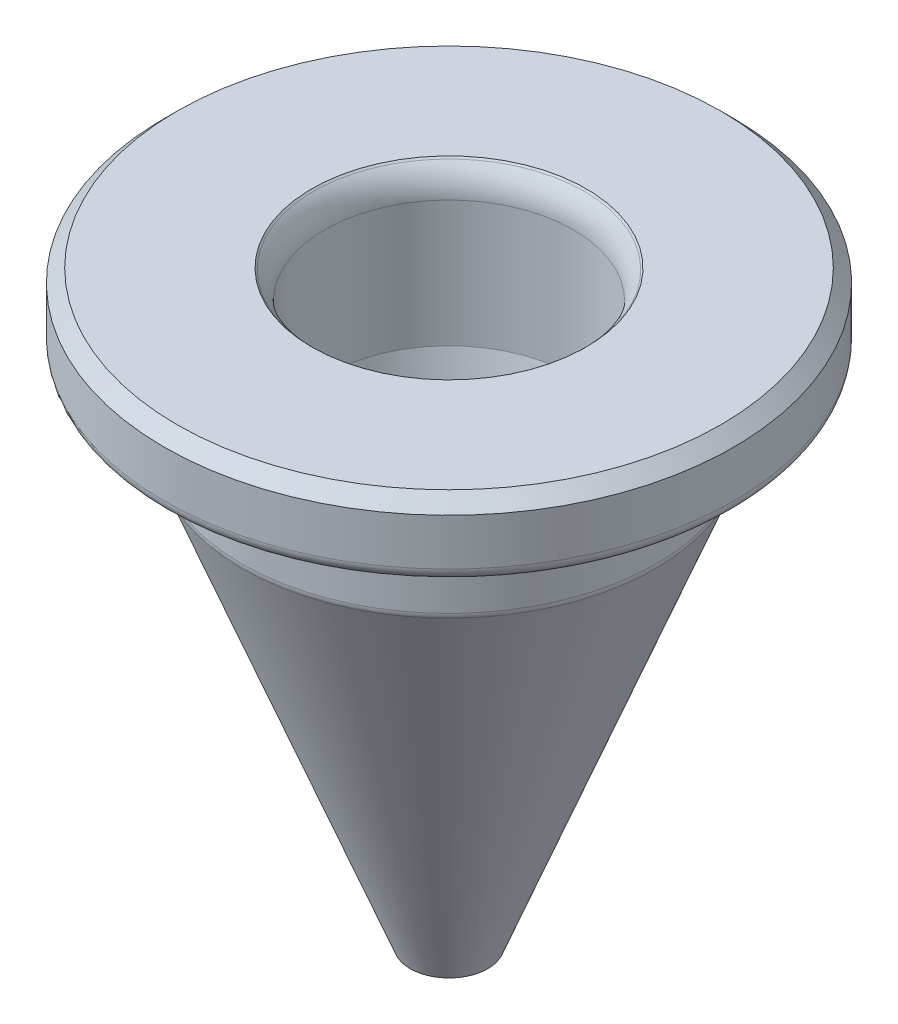
ISO-10303-21;
HEADER;
FILE_DESCRIPTION(('STEP AP214'),'2;1');
FILE_NAME('part.step','',(''),(''),'','','');
FILE_SCHEMA(('AUTOMOTIVE_DESIGN { 1 0 10303 214 1 1 1 1 }'));
ENDSEC;
DATA;
#1=APPLICATION_CONTEXT('core data for automotive mechanical design processes');
#2=APPLICATION_PROTOCOL_DEFINITION('international standard','automotive_design',2000,#1);
#3=PRODUCT_CONTEXT('',#1,'mechanical');
#4=PRODUCT('Part','Part','',(#3));
#5=PRODUCT_RELATED_PRODUCT_CATEGORY('part','',(#4));
#6=PRODUCT_DEFINITION_FORMATION('','',#4);
#7=PRODUCT_DEFINITION_CONTEXT('part definition',#1,'design');
#8=PRODUCT_DEFINITION('design','',#6,#7);
#9=PRODUCT_DEFINITION_SHAPE('','',#8);
#10=(LENGTH_UNIT() NAMED_UNIT(*) SI_UNIT(.MILLI.,.METRE.));
#11=(NAMED_UNIT(*) PLANE_ANGLE_UNIT() SI_UNIT($,.RADIAN.));
#12=(NAMED_UNIT(*) SI_UNIT($,.STERADIAN.) SOLID_ANGLE_UNIT());
#13=UNCERTAINTY_MEASURE_WITH_UNIT(LENGTH_MEASURE(1.E-05),#10,'distance_accuracy_value','');
#14=(GEOMETRIC_REPRESENTATION_CONTEXT(3) GLOBAL_UNCERTAINTY_ASSIGNED_CONTEXT((#13)) GLOBAL_UNIT_ASSIGNED_CONTEXT((#10,
#11,#12)) REPRESENTATION_CONTEXT('',''));
#15=CARTESIAN_POINT('',(0.,0.,0.));
#16=DIRECTION('',(0.,0.,1.));
#17=DIRECTION('',(1.,0.,0.));
#18=AXIS2_PLACEMENT_3D('',#15,#16,#17);
#19=CARTESIAN_POINT('',(0.,0.,0.));
#20=DIRECTION('',(0.,-1.,0.));
#21=DIRECTION('',(0.,0.,-1.));
#22=AXIS2_PLACEMENT_3D('',#19,#20,#21);
#23=CYLINDRICAL_SURFACE('',#22,8.);
#24=CARTESIAN_POINT('',(0.,19.7,0.));
#25=DIRECTION('',(0.,1.,0.));
#26=DIRECTION('',(0.,0.,1.));
#27=AXIS2_PLACEMENT_3D('',#24,#25,#26);
#28=CIRCLE('',#27,8.);
#29=CARTESIAN_POINT('',(0.,19.7,8.));
#30=VERTEX_POINT('',#29);
#31=EDGE_CURVE('E66',#30,#30,#28,.F.);
#32=ORIENTED_EDGE('',*,*,#31,.T.);
#33=EDGE_LOOP('',(#32));
#34=FACE_BOUND('',#33,.T.);
#35=CARTESIAN_POINT('',(0.,17.0938753430975,0.));
#36=DIRECTION('',(0.,1.,0.));
#37=DIRECTION('',(0.,0.,1.));
#38=AXIS2_PLACEMENT_3D('',#35,#36,#37);
#39=CIRCLE('',#38,8.);
#40=CARTESIAN_POINT('',(0.,17.0938753430975,8.));
#41=VERTEX_POINT('',#40);
#42=EDGE_CURVE('E69',#41,#41,#39,.T.);
#43=ORIENTED_EDGE('',*,*,#42,.T.);
#44=EDGE_LOOP('',(#43));
#45=FACE_BOUND('',#44,.T.);
#46=ADVANCED_FACE('F40',(#34,#45),#23,.T.);
#47=CARTESIAN_POINT('',(0.,0.,0.));
#48=DIRECTION('',(0.,1.,0.));
#49=DIRECTION('',(0.,0.,1.));
#50=AXIS2_PLACEMENT_3D('',#47,#48,#49);
#51=CONICAL_SURFACE('',#50,1.,1.03037682652431);
#52=CARTESIAN_POINT('',(0.,0.3,0.));
#53=DIRECTION('',(0.,-1.,0.));
#54=DIRECTION('',(0.,0.,-1.));
#55=AXIS2_PLACEMENT_3D('',#52,#53,#54);
#56=CIRCLE('',#55,1.5);
#57=CARTESIAN_POINT('',(0.,0.3,1.5));
#58=VERTEX_POINT('',#57);
#59=EDGE_CURVE('E87',#58,#58,#56,.T.);
#60=ORIENTED_EDGE('',*,*,#59,.T.);
#61=EDGE_LOOP('',(#60));
#62=FACE_BOUND('',#61,.T.);
#63=CARTESIAN_POINT('',(0.,0.,0.));
#64=DIRECTION('',(0.,-1.,0.));
#65=DIRECTION('',(0.,0.,-1.));
#66=AXIS2_PLACEMENT_3D('',#63,#64,#65);
#67=CIRCLE('',#66,1.);
#68=CARTESIAN_POINT('',(0.,0.,1.));
#69=VERTEX_POINT('',#68);
#70=EDGE_CURVE('E81',#69,#69,#67,.T.);
#71=ORIENTED_EDGE('',*,*,#70,.F.);
#72=EDGE_LOOP('',(#71));
#73=FACE_BOUND('',#72,.T.);
#74=ADVANCED_FACE('F91',(#62,#73),#51,.T.);
#75=CARTESIAN_POINT('',(0.,17.,0.));
#76=DIRECTION('',(0.,1.,0.));
#77=DIRECTION('',(0.,0.,1.));
#78=AXIS2_PLACEMENT_3D('',#75,#76,#77);
#79=CONICAL_SURFACE('',#78,4.8,0.219914275242624);
#80=CARTESIAN_POINT('',(0.,17.,0.));
#81=DIRECTION('',(0.,-1.,0.));
#82=DIRECTION('',(0.,0.,-1.));
#83=AXIS2_PLACEMENT_3D('',#80,#81,#82);
#84=CIRCLE('',#83,4.8);
#85=CARTESIAN_POINT('',(0.,17.,4.8));
#86=VERTEX_POINT('',#85);
#87=EDGE_CURVE('E84',#86,#86,#84,.T.);
#88=CARTESIAN_POINT('',(0.,0.,1.));
#89=CARTESIAN_POINT('',(0.,0.177083333333337,1.03958333333333));
#90=CARTESIAN_POINT('',(0.,0.35416666666667,1.07916666666667));
#91=CARTESIAN_POINT('',(0.,0.708333333333337,1.15833333333333));
#92=CARTESIAN_POINT('',(0.,0.885416666666671,1.19791666666667));
#93=CARTESIAN_POINT('',(0.,1.23958333333334,1.27708333333333));
#94=CARTESIAN_POINT('',(0.,1.41666666666667,1.31666666666667));
#95=CARTESIAN_POINT('',(0.,1.77083333333334,1.39583333333333));
#96=CARTESIAN_POINT('',(0.,1.94791666666667,1.43541666666667));
#97=CARTESIAN_POINT('',(0.,2.30208333333334,1.51458333333333));
#98=CARTESIAN_POINT('',(0.,2.47916666666667,1.55416666666667));
#99=CARTESIAN_POINT('',(0.,2.83333333333334,1.63333333333333));
#100=CARTESIAN_POINT('',(0.,3.01041666666667,1.67291666666667));
#101=CARTESIAN_POINT('',(0.,3.36458333333334,1.75208333333333));
#102=CARTESIAN_POINT('',(0.,3.54166666666667,1.79166666666667));
#103=CARTESIAN_POINT('',(0.,3.89583333333334,1.87083333333333));
#104=CARTESIAN_POINT('',(0.,4.07291666666667,1.91041666666667));
#105=CARTESIAN_POINT('',(0.,4.42708333333333,1.98958333333333));
#106=CARTESIAN_POINT('',(0.,4.60416666666667,2.02916666666667));
#107=CARTESIAN_POINT('',(0.,4.95833333333333,2.10833333333333));
#108=CARTESIAN_POINT('',(0.,5.13541666666667,2.14791666666667));
#109=CARTESIAN_POINT('',(0.,5.48958333333333,2.22708333333333));
#110=CARTESIAN_POINT('',(0.,5.66666666666667,2.26666666666667));
#111=CARTESIAN_POINT('',(0.,6.02083333333334,2.34583333333333));
#112=CARTESIAN_POINT('',(0.,6.19791666666667,2.38541666666667));
#113=CARTESIAN_POINT('',(0.,6.55208333333333,2.46458333333333));
#114=CARTESIAN_POINT('',(0.,6.72916666666667,2.50416666666667));
#115=CARTESIAN_POINT('',(0.,7.08333333333333,2.58333333333333));
#116=CARTESIAN_POINT('',(0.,7.26041666666667,2.62291666666667));
#117=CARTESIAN_POINT('',(0.,7.61458333333333,2.70208333333333));
#118=CARTESIAN_POINT('',(0.,7.79166666666667,2.74166666666667));
#119=CARTESIAN_POINT('',(0.,8.14583333333333,2.82083333333333));
#120=CARTESIAN_POINT('',(0.,8.32291666666667,2.86041666666667));
#121=CARTESIAN_POINT('',(0.,8.67708333333333,2.93958333333333));
#122=CARTESIAN_POINT('',(0.,8.85416666666667,2.97916666666667));
#123=CARTESIAN_POINT('',(0.,9.20833333333333,3.05833333333333));
#124=CARTESIAN_POINT('',(0.,9.38541666666667,3.09791666666667));
#125=CARTESIAN_POINT('',(0.,9.73958333333333,3.17708333333333));
#126=CARTESIAN_POINT('',(0.,9.91666666666667,3.21666666666667));
#127=CARTESIAN_POINT('',(0.,10.2708333333333,3.29583333333333));
#128=CARTESIAN_POINT('',(0.,10.4479166666667,3.33541666666667));
#129=CARTESIAN_POINT('',(0.,10.8020833333333,3.41458333333333));
#130=CARTESIAN_POINT('',(0.,10.9791666666667,3.45416666666667));
#131=CARTESIAN_POINT('',(0.,11.3333333333333,3.53333333333333));
#132=CARTESIAN_POINT('',(0.,11.5104166666667,3.57291666666667));
#133=CARTESIAN_POINT('',(0.,11.8645833333333,3.65208333333333));
#134=CARTESIAN_POINT('',(0.,12.0416666666667,3.69166666666667));
#135=CARTESIAN_POINT('',(0.,12.3958333333333,3.77083333333333));
#136=CARTESIAN_POINT('',(0.,12.5729166666667,3.81041666666667));
#137=CARTESIAN_POINT('',(0.,12.9270833333333,3.88958333333333));
#138=CARTESIAN_POINT('',(0.,13.1041666666667,3.92916666666667));
#139=CARTESIAN_POINT('',(0.,13.4583333333333,4.00833333333333));
#140=CARTESIAN_POINT('',(0.,13.6354166666667,4.04791666666667));
#141=CARTESIAN_POINT('',(0.,13.9895833333333,4.12708333333333));
#142=CARTESIAN_POINT('',(0.,14.1666666666667,4.16666666666667));
#143=CARTESIAN_POINT('',(0.,14.5208333333333,4.24583333333333));
#144=CARTESIAN_POINT('',(0.,14.6979166666667,4.28541666666667));
#145=CARTESIAN_POINT('',(0.,15.0520833333333,4.36458333333333));
#146=CARTESIAN_POINT('',(0.,15.2291666666667,4.40416666666667));
#147=CARTESIAN_POINT('',(0.,15.5833333333333,4.48333333333333));
#148=CARTESIAN_POINT('',(0.,15.7604166666667,4.52291666666667));
#149=CARTESIAN_POINT('',(0.,16.1145833333333,4.60208333333333));
#150=CARTESIAN_POINT('',(0.,16.2916666666667,4.64166666666667));
#151=CARTESIAN_POINT('',(0.,16.6458333333333,4.72083333333333));
#152=CARTESIAN_POINT('',(0.,16.8229166666667,4.76041666666667));
#153=CARTESIAN_POINT('',(0.,17.,4.8));
#154=B_SPLINE_CURVE_WITH_KNOTS('',3,(#88,#89,#90,#91,#92,#93,#94,#95,#96,#97,#98,#99,#100,#101,
#102,#103,#104,#105,#106,#107,#108,#109,#110,#111,#112,#113,#114,#115,#116,#117,#118,#119,#120,
#121,#122,#123,#124,#125,#126,#127,#128,#129,#130,#131,#132,#133,#134,#135,#136,#137,#138,#139,
#140,#141,#142,#143,#144,#145,#146,#147,#148,#149,#150,#151,#152,#153),.UNSPECIFIED.,.F.,.F.,(4,
2,2,2,2,2,2,2,2,2,2,2,2,2,2,2,2,2,2,2,2,2,2,2,2,2,2,2,2,2,2,2,4),(0.,0.544360289697917,
1.08872057939583,1.63308086909375,2.17744115879167,2.72180144848958,3.2661617381875,
3.81052202788542,4.35488231758333,4.89924260728125,5.44360289697917,5.98796318667708,
6.532323476375,7.07668376607292,7.62104405577083,8.16540434546875,8.70976463516667,
9.25412492486459,9.7984852145625,10.3428455042604,10.8872057939583,11.4315660836563,
11.9759263733542,12.5202866630521,13.06464695275,13.6090072424479,14.1533675321458,
14.6977278218438,15.2420881115417,15.7864484012396,16.3308086909375,16.8751689806354,
17.4195292703333),.UNSPECIFIED.);
#155=EDGE_CURVE('BSEAM118',#69,#86,#154,.T.);
#156=ORIENTED_EDGE('',*,*,#70,.T.);
#157=ORIENTED_EDGE('',*,*,#87,.F.);
#158=ORIENTED_EDGE('',*,*,#155,.T.);
#159=ORIENTED_EDGE('',*,*,#155,.F.);
#160=EDGE_LOOP('',(#156,#158,#157,#159));
#161=FACE_BOUND('',#160,.T.);
#162=ADVANCED_FACE('F118',(#161),#79,.F.);
#163=CARTESIAN_POINT('',(0.,0.,0.));
#164=DIRECTION('',(0.,-1.,0.));
#165=DIRECTION('',(0.,0.,-1.));
#166=AXIS2_PLACEMENT_3D('',#163,#164,#165);
#167=CYLINDRICAL_SURFACE('',#166,4.8);
#168=CARTESIAN_POINT('',(0.,21.8786796564404,0.));
#169=DIRECTION('',(0.,-1.,0.));
#170=DIRECTION('',(0.,0.,-1.));
#171=AXIS2_PLACEMENT_3D('',#168,#169,#170);
#172=CIRCLE('',#171,4.8);
#173=CARTESIAN_POINT('',(0.,21.8786796564404,-4.8));
#174=VERTEX_POINT('',#173);
#175=EDGE_CURVE('E47',#174,#174,#172,.F.);
#176=ORIENTED_EDGE('',*,*,#175,.T.);
#177=EDGE_LOOP('',(#176));
#178=FACE_BOUND('',#177,.T.);
#179=ORIENTED_EDGE('',*,*,#87,.T.);
#180=EDGE_LOOP('',(#179));
#181=FACE_BOUND('',#180,.T.);
#182=ADVANCED_FACE('F109',(#178,#181),#167,.F.);
#183=CARTESIAN_POINT('',(4.8,23.,0.));
#184=DIRECTION('',(0.,1.,0.));
#185=DIRECTION('',(0.,0.,1.));
#186=AXIS2_PLACEMENT_3D('',#183,#184,#185);
#187=PLANE('',#186);
#188=CARTESIAN_POINT('',(0.,23.,0.));
#189=DIRECTION('',(0.,1.,0.));
#190=DIRECTION('',(0.,0.,1.));
#191=AXIS2_PLACEMENT_3D('',#188,#189,#190);
#192=CIRCLE('',#191,10.5);
#193=CARTESIAN_POINT('',(0.,23.,10.5));
#194=VERTEX_POINT('',#193);
#195=EDGE_CURVE('E55',#194,#194,#192,.T.);
#196=ORIENTED_EDGE('',*,*,#195,.T.);
#197=EDGE_LOOP('',(#196));
#198=FACE_BOUND('',#197,.T.);
#199=CARTESIAN_POINT('',(0.,23.,0.));
#200=DIRECTION('',(0.,1.,0.));
#201=DIRECTION('',(0.,0.,1.));
#202=AXIS2_PLACEMENT_3D('',#199,#200,#201);
#203=CIRCLE('',#202,5.3);
#204=CARTESIAN_POINT('',(0.,23.,5.3));
#205=VERTEX_POINT('',#204);
#206=EDGE_CURVE('E60',#205,#205,#203,.F.);
#207=ORIENTED_EDGE('',*,*,#206,.T.);
#208=EDGE_LOOP('',(#207));
#209=FACE_BOUND('',#208,.T.);
#210=ADVANCED_FACE('F97',(#198,#209),#187,.T.);
#211=CARTESIAN_POINT('',(0.,0.3,0.));
#212=DIRECTION('',(0.,1.,0.));
#213=DIRECTION('',(0.,0.,1.));
#214=AXIS2_PLACEMENT_3D('',#211,#212,#213);
#215=CONICAL_SURFACE('',#214,1.5,0.371180222638774);
#216=CARTESIAN_POINT('',(0.,16.9125175762486,0.));
#217=DIRECTION('',(0.,-1.,0.));
#218=DIRECTION('',(0.,0.,-1.));
#219=AXIS2_PLACEMENT_3D('',#216,#217,#218);
#220=CIRCLE('',#219,7.9659499548273);
#221=CARTESIAN_POINT('',(0.,16.9125175762486,7.9659499548273));
#222=VERTEX_POINT('',#221);
#223=EDGE_CURVE('E63',#222,#222,#220,.T.);
#224=CARTESIAN_POINT('',(0.,16.9125175762486,7.9659499548273));
#225=CARTESIAN_POINT('',(0.,16.7394705181627,7.89859630946451));
#226=CARTESIAN_POINT('',(0.,16.5664234600767,7.83124266410173));
#227=CARTESIAN_POINT('',(0.,16.2203293439049,7.69653537337616));
#228=CARTESIAN_POINT('',(0.,16.047282285819,7.62918172801337));
#229=CARTESIAN_POINT('',(0.,15.7011881696471,7.49447443728781));
#230=CARTESIAN_POINT('',(0.,15.5281411115612,7.42712079192502));
#231=CARTESIAN_POINT('',(0.,15.1820469953894,7.29241350119945));
#232=CARTESIAN_POINT('',(0.,15.0089999373034,7.22505985583667));
#233=CARTESIAN_POINT('',(0.,14.6629058211316,7.0903525651111));
#234=CARTESIAN_POINT('',(0.,14.4898587630457,7.02299891974832));
#235=CARTESIAN_POINT('',(0.,14.1437646468738,6.88829162902275));
#236=CARTESIAN_POINT('',(0.,13.9707175887879,6.82093798365996));
#237=CARTESIAN_POINT('',(0.,13.6246234726161,6.6862306929344));
#238=CARTESIAN_POINT('',(0.,13.4515764145301,6.61887704757161));
#239=CARTESIAN_POINT('',(0.,13.1054822983583,6.48416975684604));
#240=CARTESIAN_POINT('',(0.,12.9324352402724,6.41681611148326));
#241=CARTESIAN_POINT('',(0.,12.5863411241005,6.28210882075769));
#242=CARTESIAN_POINT('',(0.,12.4132940660146,6.21475517539491));
#243=CARTESIAN_POINT('',(0.,12.0671999498428,6.08004788466934));
#244=CARTESIAN_POINT('',(0.,11.8941528917568,6.01269423930655));
#245=CARTESIAN_POINT('',(0.,11.548058775585,5.87798694858098));
#246=CARTESIAN_POINT('',(0.,11.3750117174991,5.8106333032182));
#247=CARTESIAN_POINT('',(0.,11.0289176013272,5.67592601249263));
#248=CARTESIAN_POINT('',(0.,10.8558705432413,5.60857236712985));
#249=CARTESIAN_POINT('',(0.,10.5097764270694,5.47386507640428));
#250=CARTESIAN_POINT('',(0.,10.3367293689835,5.40651143104149));
#251=CARTESIAN_POINT('',(0.,9.99063525281168,5.27180414031592));
#252=CARTESIAN_POINT('',(0.,9.81758819472575,5.20445049495314));
#253=CARTESIAN_POINT('',(0.,9.47149407855391,5.06974320422757));
#254=CARTESIAN_POINT('',(0.,9.29844702046799,5.00238955886479));
#255=CARTESIAN_POINT('',(0.,8.95235290429614,4.86768226813922));
#256=CARTESIAN_POINT('',(0.,8.77930584621022,4.80032862277643));
#257=CARTESIAN_POINT('',(0.,8.43321173003837,4.66562133205086));
#258=CARTESIAN_POINT('',(0.,8.26016467195245,4.59826768668808));
#259=CARTESIAN_POINT('',(0.,7.9140705557806,4.46356039596251));
#260=CARTESIAN_POINT('',(0.,7.74102349769468,4.39620675059973));
#261=CARTESIAN_POINT('',(0.,7.39492938152283,4.26149945987416));
#262=CARTESIAN_POINT('',(0.,7.22188232343691,4.19414581451137));
#263=CARTESIAN_POINT('',(0.,6.87578820726507,4.05943852378581));
#264=CARTESIAN_POINT('',(0.,6.70274114917914,3.99208487842302));
#265=CARTESIAN_POINT('',(0.,6.3566470330073,3.85737758769745));
#266=CARTESIAN_POINT('',(0.,6.18359997492138,3.79002394233467));
#267=CARTESIAN_POINT('',(0.,5.83750585874953,3.6553166516091));
#268=CARTESIAN_POINT('',(0.,5.66445880066361,3.58796300624632));
#269=CARTESIAN_POINT('',(0.,5.31836468449176,3.45325571552075));
#270=CARTESIAN_POINT('',(0.,5.14531762640584,3.38590207015796));
#271=CARTESIAN_POINT('',(0.,4.79922351023399,3.25119477943239));
#272=CARTESIAN_POINT('',(0.,4.62617645214807,3.18384113406961));
#273=CARTESIAN_POINT('',(0.,4.28008233597622,3.04913384334404));
#274=CARTESIAN_POINT('',(0.,4.1070352778903,2.98178019798126));
#275=CARTESIAN_POINT('',(0.,3.76094116171846,2.84707290725569));
#276=CARTESIAN_POINT('',(0.,3.58789410363253,2.7797192618929));
#277=CARTESIAN_POINT('',(0.,3.24179998746069,2.64501197116733));
#278=CARTESIAN_POINT('',(0.,3.06875292937476,2.57765832580455));
#279=CARTESIAN_POINT('',(0.,2.72265881320292,2.44295103507898));
#280=CARTESIAN_POINT('',(0.,2.549611755117,2.3755973897162));
#281=CARTESIAN_POINT('',(0.,2.20351763894515,2.24089009899063));
#282=CARTESIAN_POINT('',(0.,2.03047058085923,2.17353645362784));
#283=CARTESIAN_POINT('',(0.,1.68437646468738,2.03882916290228));
#284=CARTESIAN_POINT('',(0.,1.51132940660146,1.97147551753949));
#285=CARTESIAN_POINT('',(0.,1.16523529042961,1.83676822681392));
#286=CARTESIAN_POINT('',(0.,0.992188232343692,1.76941458145114));
#287=CARTESIAN_POINT('',(0.,0.646094116171846,1.63470729072557));
#288=CARTESIAN_POINT('',(0.,0.473047058085923,1.56735364536278));
#289=CARTESIAN_POINT('',(0.,0.3,1.5));
#290=B_SPLINE_CURVE_WITH_KNOTS('',3,(#224,#225,#226,#227,#228,#229,#230,#231,#232,#233,#234,
#235,#236,#237,#238,#239,#240,#241,#242,#243,#244,#245,#246,#247,#248,#249,#250,#251,#252,#253,
#254,#255,#256,#257,#258,#259,#260,#261,#262,#263,#264,#265,#266,#267,#268,#269,#270,#271,#272,
#273,#274,#275,#276,#277,#278,#279,#280,#281,#282,#283,#284,#285,#286,#287,#288,#289),
.UNSPECIFIED.,.F.,.F.,(4,2,2,2,2,2,2,2,2,2,2,2,2,2,2,2,2,2,2,2,2,2,2,2,2,2,2,2,2,2,2,2,4),(0.,
0.557078253661581,1.11415650732316,1.67123476098474,2.22831301464633,2.78539126830791,
3.34246952196948,3.89954777563106,4.45662602929265,5.01370428295423,5.57078253661581,
6.12786079027739,6.68493904393897,7.24201729760055,7.79909555126213,8.35617380492371,
8.91325205858529,9.47033031224687,10.0274085659084,10.58448681957,11.1415650732316,
11.6986433268932,12.2557215805548,12.8127998342163,13.3698780878779,13.9269563415395,
14.4840345952011,15.0411128488627,15.5981911025242,16.1552693561858,16.7123476098474,
17.269425863509,17.8265041171706),.UNSPECIFIED.);
#291=EDGE_CURVE('BSEAM94',#222,#58,#290,.T.);
#292=ORIENTED_EDGE('',*,*,#223,.T.);
#293=ORIENTED_EDGE('',*,*,#59,.F.);
#294=ORIENTED_EDGE('',*,*,#291,.T.);
#295=ORIENTED_EDGE('',*,*,#291,.F.);
#296=EDGE_LOOP('',(#292,#294,#293,#295));
#297=FACE_BOUND('',#296,.T.);
#298=ADVANCED_FACE('F94',(#297),#215,.T.);
#299=CARTESIAN_POINT('',(0.,20.2,0.));
#300=DIRECTION('',(0.,1.,0.));
#301=DIRECTION('',(0.,0.,1.));
#302=AXIS2_PLACEMENT_3D('',#299,#300,#301);
#303=CYLINDRICAL_SURFACE('',#302,11.);
#304=CARTESIAN_POINT('',(0.,22.5,0.));
#305=DIRECTION('',(0.,1.,0.));
#306=DIRECTION('',(0.,0.,1.));
#307=AXIS2_PLACEMENT_3D('',#304,#305,#306);
#308=CIRCLE('',#307,11.);
#309=CARTESIAN_POINT('',(0.,22.5,11.));
#310=VERTEX_POINT('',#309);
#311=EDGE_CURVE('E51',#310,#310,#308,.F.);
#312=ORIENTED_EDGE('',*,*,#311,.T.);
#313=EDGE_LOOP('',(#312));
#314=FACE_BOUND('',#313,.T.);
#315=CARTESIAN_POINT('',(0.,20.7,0.));
#316=DIRECTION('',(0.,1.,0.));
#317=DIRECTION('',(0.,0.,1.));
#318=AXIS2_PLACEMENT_3D('',#315,#316,#317);
#319=CIRCLE('',#318,11.);
#320=CARTESIAN_POINT('',(0.,20.7,11.));
#321=VERTEX_POINT('',#320);
#322=EDGE_CURVE('E78',#321,#321,#319,.T.);
#323=ORIENTED_EDGE('',*,*,#322,.T.);
#324=EDGE_LOOP('',(#323));
#325=FACE_BOUND('',#324,.T.);
#326=ADVANCED_FACE('F96',(#314,#325),#303,.T.);
#327=CARTESIAN_POINT('',(0.,20.2,0.));
#328=DIRECTION('',(0.,1.,0.));
#329=DIRECTION('',(0.,0.,1.));
#330=AXIS2_PLACEMENT_3D('',#327,#328,#329);
#331=PLANE('',#330);
#332=CARTESIAN_POINT('',(0.,20.2,0.));
#333=DIRECTION('',(0.,1.,0.));
#334=DIRECTION('',(0.,0.,1.));
#335=AXIS2_PLACEMENT_3D('',#332,#333,#334);
#336=CIRCLE('',#335,10.5);
#337=CARTESIAN_POINT('',(0.,20.2,10.5));
#338=VERTEX_POINT('',#337);
#339=EDGE_CURVE('E72',#338,#338,#336,.F.);
#340=ORIENTED_EDGE('',*,*,#339,.T.);
#341=EDGE_LOOP('',(#340));
#342=FACE_BOUND('',#341,.T.);
#343=CARTESIAN_POINT('',(0.,20.2,0.));
#344=DIRECTION('',(0.,1.,0.));
#345=DIRECTION('',(0.,0.,1.));
#346=AXIS2_PLACEMENT_3D('',#343,#344,#345);
#347=CIRCLE('',#346,8.5);
#348=CARTESIAN_POINT('',(0.,20.2,8.5));
#349=VERTEX_POINT('',#348);
#350=EDGE_CURVE('E75',#349,#349,#347,.T.);
#351=ORIENTED_EDGE('',*,*,#350,.T.);
#352=EDGE_LOOP('',(#351));
#353=FACE_BOUND('',#352,.T.);
#354=ADVANCED_FACE('F105',(#342,#353),#331,.F.);
#355=CARTESIAN_POINT('',(0.,20.7,0.));
#356=DIRECTION('',(0.,1.,0.));
#357=DIRECTION('',(0.,0.,1.));
#358=AXIS2_PLACEMENT_3D('',#355,#356,#357);
#359=TOROIDAL_SURFACE('',#358,10.5,0.5);
#360=ORIENTED_EDGE('',*,*,#339,.F.);
#361=EDGE_LOOP('',(#360));
#362=FACE_BOUND('',#361,.T.);
#363=ORIENTED_EDGE('',*,*,#322,.F.);
#364=EDGE_LOOP('',(#363));
#365=FACE_BOUND('',#364,.T.);
#366=ADVANCED_FACE('F126',(#362,#365),#359,.T.);
#367=CARTESIAN_POINT('',(0.,19.7,0.));
#368=DIRECTION('',(0.,1.,0.));
#369=DIRECTION('',(0.,0.,1.));
#370=AXIS2_PLACEMENT_3D('',#367,#368,#369);
#371=TOROIDAL_SURFACE('',#370,8.5,0.5);
#372=ORIENTED_EDGE('',*,*,#350,.F.);
#373=EDGE_LOOP('',(#372));
#374=FACE_BOUND('',#373,.T.);
#375=ORIENTED_EDGE('',*,*,#31,.F.);
#376=EDGE_LOOP('',(#375));
#377=FACE_BOUND('',#376,.T.);
#378=ADVANCED_FACE('F129',(#374,#377),#371,.F.);
#379=CARTESIAN_POINT('',(0.,17.0938753430975,0.));
#380=DIRECTION('',(0.,1.,0.));
#381=DIRECTION('',(0.,0.,1.));
#382=AXIS2_PLACEMENT_3D('',#379,#380,#381);
#383=TOROIDAL_SURFACE('',#382,7.5,0.5);
#384=ORIENTED_EDGE('',*,*,#42,.F.);
#385=EDGE_LOOP('',(#384));
#386=FACE_BOUND('',#385,.T.);
#387=ORIENTED_EDGE('',*,*,#223,.F.);
#388=EDGE_LOOP('',(#387));
#389=FACE_BOUND('',#388,.T.);
#390=ADVANCED_FACE('F133',(#386,#389),#383,.T.);
#391=CARTESIAN_POINT('',(0.,23.,0.));
#392=DIRECTION('',(0.,-1.,0.));
#393=DIRECTION('',(0.,0.,-1.));
#394=AXIS2_PLACEMENT_3D('',#391,#392,#393);
#395=CONICAL_SURFACE('',#394,10.5,0.785398163397452);
#396=ORIENTED_EDGE('',*,*,#311,.F.);
#397=EDGE_LOOP('',(#396));
#398=FACE_BOUND('',#397,.T.);
#399=ORIENTED_EDGE('',*,*,#195,.F.);
#400=EDGE_LOOP('',(#399));
#401=FACE_BOUND('',#400,.T.);
#402=ADVANCED_FACE('F137',(#398,#401),#395,.T.);
#403=CARTESIAN_POINT('',(0.,23.,0.));
#404=DIRECTION('',(0.,1.,0.));
#405=DIRECTION('',(0.,0.,1.));
#406=AXIS2_PLACEMENT_3D('',#403,#404,#405);
#407=CONICAL_SURFACE('',#406,5.3,0.785398163397448);
#408=CARTESIAN_POINT('',(0.,22.9393398282202,0.));
#409=DIRECTION('',(0.,-1.,0.));
#410=DIRECTION('',(0.,0.,-1.));
#411=AXIS2_PLACEMENT_3D('',#408,#409,#410);
#412=CIRCLE('',#411,5.23933982822018);
#413=CARTESIAN_POINT('',(0.,22.9393398282202,-5.23933982822018));
#414=VERTEX_POINT('',#413);
#415=EDGE_CURVE('E11',#414,#414,#412,.T.);
#416=ORIENTED_EDGE('',*,*,#415,.T.);
#417=EDGE_LOOP('',(#416));
#418=FACE_BOUND('',#417,.T.);
#419=ORIENTED_EDGE('',*,*,#206,.F.);
#420=EDGE_LOOP('',(#419));
#421=FACE_BOUND('',#420,.T.);
#422=ADVANCED_FACE('F144',(#418,#421),#407,.F.);
#423=CARTESIAN_POINT('',(0.,21.8786796564404,0.));
#424=DIRECTION('',(0.,-1.,0.));
#425=DIRECTION('',(0.,0.,-1.));
#426=AXIS2_PLACEMENT_3D('',#423,#424,#425);
#427=TOROIDAL_SURFACE('',#426,6.3,1.5);
#428=ORIENTED_EDGE('',*,*,#415,.F.);
#429=EDGE_LOOP('',(#428));
#430=FACE_BOUND('',#429,.T.);
#431=ORIENTED_EDGE('',*,*,#175,.F.);
#432=EDGE_LOOP('',(#431));
#433=FACE_BOUND('',#432,.T.);
#434=ADVANCED_FACE('F42',(#430,#433),#427,.T.);
#435=CLOSED_SHELL('',(#46,#74,#162,#182,#210,#298,#326,#354,#366,#378,#390,#402,#422,#434));
#436=MANIFOLD_SOLID_BREP('B2',#435);
#437=ADVANCED_BREP_SHAPE_REPRESENTATION('',(#18,#436),#14);
#438=SHAPE_DEFINITION_REPRESENTATION(#9,#437);
ENDSEC;
END-ISO-10303-21;
